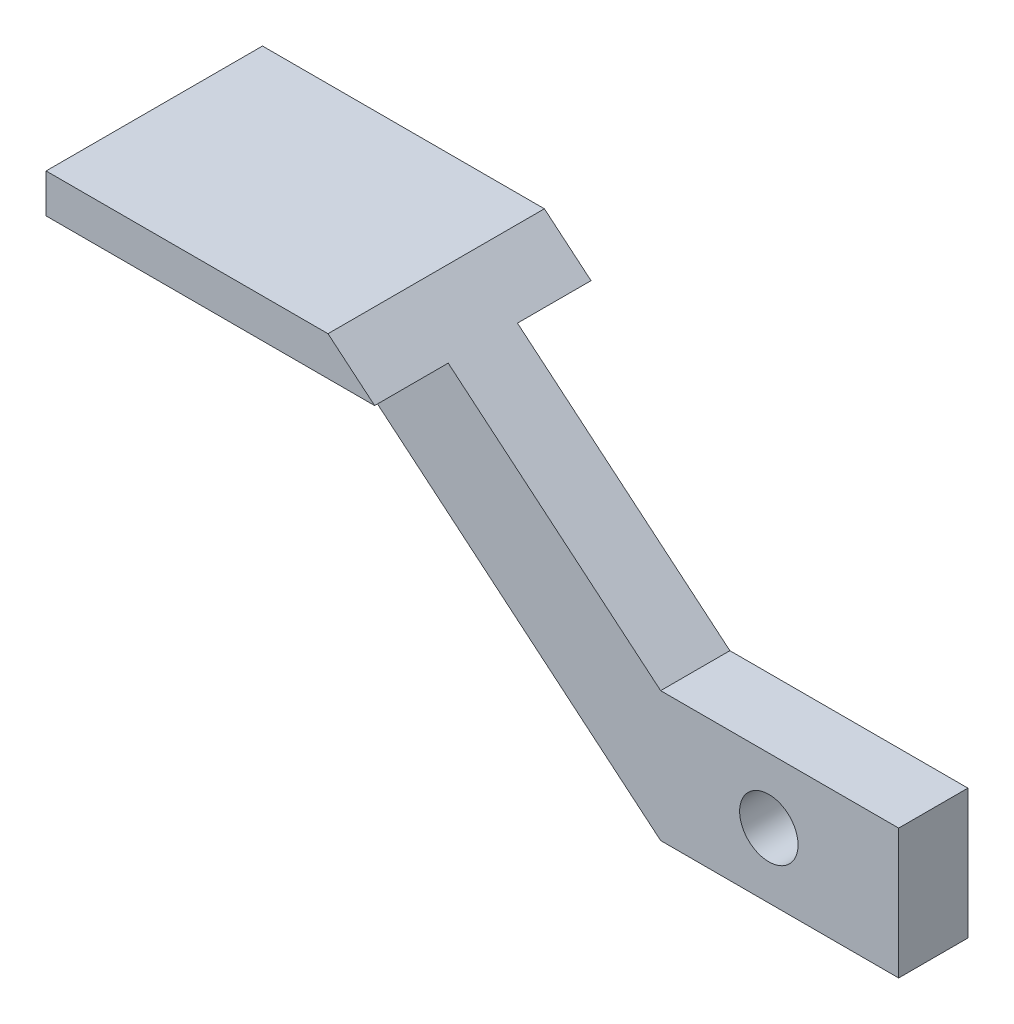
ISO-10303-21;
HEADER;
FILE_DESCRIPTION(('STEP AP214'),'2;1');
FILE_NAME('part.step','',(''),(''),'','','');
FILE_SCHEMA(('AUTOMOTIVE_DESIGN { 1 0 10303 214 1 1 1 1 }'));
ENDSEC;
DATA;
#1=APPLICATION_CONTEXT('core data for automotive mechanical design processes');
#2=APPLICATION_PROTOCOL_DEFINITION('international standard','automotive_design',2000,#1);
#3=PRODUCT_CONTEXT('',#1,'mechanical');
#4=PRODUCT('Part','Part','',(#3));
#5=PRODUCT_RELATED_PRODUCT_CATEGORY('part','',(#4));
#6=PRODUCT_DEFINITION_FORMATION('','',#4);
#7=PRODUCT_DEFINITION_CONTEXT('part definition',#1,'design');
#8=PRODUCT_DEFINITION('design','',#6,#7);
#9=PRODUCT_DEFINITION_SHAPE('','',#8);
#10=(LENGTH_UNIT() NAMED_UNIT(*) SI_UNIT(.MILLI.,.METRE.));
#11=(NAMED_UNIT(*) PLANE_ANGLE_UNIT() SI_UNIT($,.RADIAN.));
#12=(NAMED_UNIT(*) SI_UNIT($,.STERADIAN.) SOLID_ANGLE_UNIT());
#13=UNCERTAINTY_MEASURE_WITH_UNIT(LENGTH_MEASURE(1.E-05),#10,'distance_accuracy_value','');
#14=(GEOMETRIC_REPRESENTATION_CONTEXT(3) GLOBAL_UNCERTAINTY_ASSIGNED_CONTEXT((#13)) GLOBAL_UNIT_ASSIGNED_CONTEXT((#10,
#11,#12)) REPRESENTATION_CONTEXT('',''));
#15=CARTESIAN_POINT('',(0.,0.,0.));
#16=DIRECTION('',(0.,0.,1.));
#17=DIRECTION('',(1.,0.,0.));
#18=AXIS2_PLACEMENT_3D('',#15,#16,#17);
#19=CARTESIAN_POINT('',(0.,0.,8.));
#20=DIRECTION('',(0.,0.,1.));
#21=DIRECTION('',(1.,0.,0.));
#22=AXIS2_PLACEMENT_3D('',#19,#20,#21);
#23=PLANE('',#22);
#24=CARTESIAN_POINT('',(-30.,-15.,8.));
#25=DIRECTION('',(0.,0.,1.));
#26=DIRECTION('',(1.,0.,0.));
#27=AXIS2_PLACEMENT_3D('',#24,#25,#26);
#28=CIRCLE('',#27,6.75);
#29=CARTESIAN_POINT('',(-23.25,-15.,8.));
#30=VERTEX_POINT('',#29);
#31=EDGE_CURVE('E164',#30,#30,#28,.T.);
#32=ORIENTED_EDGE('',*,*,#31,.F.);
#33=EDGE_LOOP('',(#32));
#34=FACE_BOUND('',#33,.T.);
#35=DIRECTION('',(0.767480669158115,-0.641072088355602,0.));
#36=VECTOR('',#35,1.);
#37=CARTESIAN_POINT('',(-22.6035382357737,-27.0605739442361,8.));
#38=LINE('',#37,#36);
#39=CARTESIAN_POINT('',(-104.084507042254,41.,8.));
#40=VERTEX_POINT('',#39);
#41=CARTESIAN_POINT('',(-55.,0.,8.));
#42=VERTEX_POINT('',#41);
#43=EDGE_CURVE('E174',#40,#42,#38,.T.);
#44=ORIENTED_EDGE('',*,*,#43,.F.);
#45=DIRECTION('',(-1.,0.,0.));
#46=VECTOR('',#45,1.);
#47=CARTESIAN_POINT('',(0.,41.,8.));
#48=LINE('',#47,#46);
#49=CARTESIAN_POINT('',(-140.,41.,8.));
#50=VERTEX_POINT('',#49);
#51=EDGE_CURVE('E161',#40,#50,#48,.T.);
#52=ORIENTED_EDGE('',*,*,#51,.T.);
#53=DIRECTION('',(-0.767480669158115,0.641072088355602,0.));
#54=VECTOR('',#53,1.);
#55=CARTESIAN_POINT('',(-37.3638512962661,-44.7313712701777,8.));
#56=LINE('',#55,#54);
#57=CARTESIAN_POINT('',(-55.,-30.,8.));
#58=VERTEX_POINT('',#57);
#59=EDGE_CURVE('E176',#58,#50,#56,.T.);
#60=ORIENTED_EDGE('',*,*,#59,.F.);
#61=DIRECTION('',(1.,0.,0.));
#62=VECTOR('',#61,1.);
#63=CARTESIAN_POINT('',(0.,-30.,8.));
#64=LINE('',#63,#62);
#65=CARTESIAN_POINT('',(0.,-30.,8.));
#66=VERTEX_POINT('',#65);
#67=EDGE_CURVE('E167',#58,#66,#64,.T.);
#68=ORIENTED_EDGE('',*,*,#67,.T.);
#69=DIRECTION('',(0.,1.,0.));
#70=VECTOR('',#69,1.);
#71=CARTESIAN_POINT('',(0.,0.,8.));
#72=LINE('',#71,#70);
#73=CARTESIAN_POINT('',(0.,0.,8.));
#74=VERTEX_POINT('',#73);
#75=EDGE_CURVE('E85',#66,#74,#72,.T.);
#76=ORIENTED_EDGE('',*,*,#75,.T.);
#77=DIRECTION('',(-1.,0.,0.));
#78=VECTOR('',#77,1.);
#79=CARTESIAN_POINT('',(0.,0.,8.));
#80=LINE('',#79,#78);
#81=EDGE_CURVE('E171',#74,#42,#80,.T.);
#82=ORIENTED_EDGE('',*,*,#81,.T.);
#83=EDGE_LOOP('',(#44,#52,#60,#68,#76,#82));
#84=FACE_BOUND('',#83,.T.);
#85=ADVANCED_FACE('F34',(#34,#84),#23,.T.);
#86=CARTESIAN_POINT('',(0.,0.,-8.));
#87=DIRECTION('',(0.,0.,1.));
#88=DIRECTION('',(1.,0.,0.));
#89=AXIS2_PLACEMENT_3D('',#86,#87,#88);
#90=PLANE('',#89);
#91=CARTESIAN_POINT('',(-30.,-15.,-8.));
#92=DIRECTION('',(0.,0.,1.));
#93=DIRECTION('',(1.,0.,0.));
#94=AXIS2_PLACEMENT_3D('',#91,#92,#93);
#95=CIRCLE('',#94,6.75);
#96=CARTESIAN_POINT('',(-23.25,-15.,-8.));
#97=VERTEX_POINT('',#96);
#98=EDGE_CURVE('E163',#97,#97,#95,.T.);
#99=ORIENTED_EDGE('',*,*,#98,.T.);
#100=EDGE_LOOP('',(#99));
#101=FACE_BOUND('',#100,.T.);
#102=DIRECTION('',(-1.,0.,0.));
#103=VECTOR('',#102,1.);
#104=CARTESIAN_POINT('',(0.,41.,-8.));
#105=LINE('',#104,#103);
#106=CARTESIAN_POINT('',(-104.084507042254,41.,-8.));
#107=VERTEX_POINT('',#106);
#108=CARTESIAN_POINT('',(-140.,41.,-8.));
#109=VERTEX_POINT('',#108);
#110=EDGE_CURVE('E11',#107,#109,#105,.T.);
#111=ORIENTED_EDGE('',*,*,#110,.F.);
#112=DIRECTION('',(0.767480669158115,-0.641072088355602,0.));
#113=VECTOR('',#112,1.);
#114=CARTESIAN_POINT('',(-22.6035382357737,-27.0605739442361,-8.));
#115=LINE('',#114,#113);
#116=CARTESIAN_POINT('',(-55.,0.,-8.));
#117=VERTEX_POINT('',#116);
#118=EDGE_CURVE('E187',#107,#117,#115,.T.);
#119=ORIENTED_EDGE('',*,*,#118,.T.);
#120=DIRECTION('',(-1.,0.,0.));
#121=VECTOR('',#120,1.);
#122=CARTESIAN_POINT('',(0.,0.,-8.));
#123=LINE('',#122,#121);
#124=CARTESIAN_POINT('',(0.,0.,-8.));
#125=VERTEX_POINT('',#124);
#126=EDGE_CURVE('E184',#125,#117,#123,.T.);
#127=ORIENTED_EDGE('',*,*,#126,.F.);
#128=DIRECTION('',(0.,1.,0.));
#129=VECTOR('',#128,1.);
#130=CARTESIAN_POINT('',(0.,0.,-8.));
#131=LINE('',#130,#129);
#132=CARTESIAN_POINT('',(0.,-30.,-8.));
#133=VERTEX_POINT('',#132);
#134=EDGE_CURVE('E182',#133,#125,#131,.T.);
#135=ORIENTED_EDGE('',*,*,#134,.F.);
#136=DIRECTION('',(1.,0.,0.));
#137=VECTOR('',#136,1.);
#138=CARTESIAN_POINT('',(0.,-30.,-8.));
#139=LINE('',#138,#137);
#140=CARTESIAN_POINT('',(-55.,-30.,-8.));
#141=VERTEX_POINT('',#140);
#142=EDGE_CURVE('E180',#141,#133,#139,.T.);
#143=ORIENTED_EDGE('',*,*,#142,.F.);
#144=DIRECTION('',(-0.767480669158115,0.641072088355602,0.));
#145=VECTOR('',#144,1.);
#146=CARTESIAN_POINT('',(-37.3638512962661,-44.7313712701777,-8.));
#147=LINE('',#146,#145);
#148=EDGE_CURVE('E168',#141,#109,#147,.T.);
#149=ORIENTED_EDGE('',*,*,#148,.T.);
#150=EDGE_LOOP('',(#111,#119,#127,#135,#143,#149));
#151=FACE_BOUND('',#150,.T.);
#152=ADVANCED_FACE('F203',(#101,#151),#90,.F.);
#153=CARTESIAN_POINT('',(0.,-30.,8.));
#154=DIRECTION('',(0.,1.,0.));
#155=DIRECTION('',(0.,0.,1.));
#156=AXIS2_PLACEMENT_3D('',#153,#154,#155);
#157=PLANE('',#156);
#158=ORIENTED_EDGE('',*,*,#142,.T.);
#159=DIRECTION('',(0.,0.,-1.));
#160=VECTOR('',#159,1.);
#161=CARTESIAN_POINT('',(0.,-30.,8.));
#162=LINE('',#161,#160);
#163=EDGE_CURVE('E42',#66,#133,#162,.T.);
#164=ORIENTED_EDGE('',*,*,#163,.F.);
#165=ORIENTED_EDGE('',*,*,#67,.F.);
#166=DIRECTION('',(0.,0.,-1.));
#167=VECTOR('',#166,1.);
#168=CARTESIAN_POINT('',(-55.,-30.,8.));
#169=LINE('',#168,#167);
#170=EDGE_CURVE('E56',#58,#141,#169,.T.);
#171=ORIENTED_EDGE('',*,*,#170,.T.);
#172=EDGE_LOOP('',(#158,#164,#165,#171));
#173=FACE_BOUND('',#172,.T.);
#174=ADVANCED_FACE('F202',(#173),#157,.F.);
#175=CARTESIAN_POINT('',(0.,0.,8.));
#176=DIRECTION('',(-1.,0.,0.));
#177=DIRECTION('',(0.,0.,1.));
#178=AXIS2_PLACEMENT_3D('',#175,#176,#177);
#179=PLANE('',#178);
#180=ORIENTED_EDGE('',*,*,#134,.T.);
#181=DIRECTION('',(0.,0.,-1.));
#182=VECTOR('',#181,1.);
#183=CARTESIAN_POINT('',(0.,0.,8.));
#184=LINE('',#183,#182);
#185=EDGE_CURVE('E198',#74,#125,#184,.T.);
#186=ORIENTED_EDGE('',*,*,#185,.F.);
#187=ORIENTED_EDGE('',*,*,#75,.F.);
#188=ORIENTED_EDGE('',*,*,#163,.T.);
#189=EDGE_LOOP('',(#180,#186,#187,#188));
#190=FACE_BOUND('',#189,.T.);
#191=ADVANCED_FACE('F201',(#190),#179,.F.);
#192=CARTESIAN_POINT('',(0.,0.,8.));
#193=DIRECTION('',(0.,-1.,0.));
#194=DIRECTION('',(1.,0.,0.));
#195=AXIS2_PLACEMENT_3D('',#192,#193,#194);
#196=PLANE('',#195);
#197=ORIENTED_EDGE('',*,*,#126,.T.);
#198=DIRECTION('',(0.,0.,-1.));
#199=VECTOR('',#198,1.);
#200=CARTESIAN_POINT('',(-55.,0.,8.));
#201=LINE('',#200,#199);
#202=EDGE_CURVE('E195',#42,#117,#201,.T.);
#203=ORIENTED_EDGE('',*,*,#202,.F.);
#204=ORIENTED_EDGE('',*,*,#81,.F.);
#205=ORIENTED_EDGE('',*,*,#185,.T.);
#206=EDGE_LOOP('',(#197,#203,#204,#205));
#207=FACE_BOUND('',#206,.T.);
#208=ADVANCED_FACE('F215',(#207),#196,.F.);
#209=CARTESIAN_POINT('',(-22.6035382357737,-27.0605739442361,8.));
#210=DIRECTION('',(0.641072088355602,0.767480669158115,0.));
#211=DIRECTION('',(-0.767480669158115,0.641072088355602,0.));
#212=AXIS2_PLACEMENT_3D('',#209,#210,#211);
#213=PLANE('',#212);
#214=DIRECTION('',(0.,0.,-1.));
#215=VECTOR('',#214,1.);
#216=CARTESIAN_POINT('',(-104.084507042254,41.,25.));
#217=LINE('',#216,#215);
#218=CARTESIAN_POINT('',(-104.084507042254,41.,25.));
#219=VERTEX_POINT('',#218);
#220=EDGE_CURVE('E136',#219,#40,#217,.T.);
#221=ORIENTED_EDGE('',*,*,#220,.T.);
#222=ORIENTED_EDGE('',*,*,#43,.T.);
#223=ORIENTED_EDGE('',*,*,#202,.T.);
#224=ORIENTED_EDGE('',*,*,#118,.F.);
#225=CARTESIAN_POINT('',(-104.084507042254,41.,-25.));
#226=VERTEX_POINT('',#225);
#227=EDGE_CURVE('E154',#107,#226,#217,.T.);
#228=ORIENTED_EDGE('',*,*,#227,.T.);
#229=DIRECTION('',(-0.767480669158115,0.641072088355602,0.));
#230=VECTOR('',#229,1.);
#231=CARTESIAN_POINT('',(-22.6035382357737,-27.0605739442361,-25.));
#232=LINE('',#231,#230);
#233=CARTESIAN_POINT('',(-114.859154929577,50.,-25.));
#234=VERTEX_POINT('',#233);
#235=EDGE_CURVE('E149',#226,#234,#232,.T.);
#236=ORIENTED_EDGE('',*,*,#235,.T.);
#237=DIRECTION('',(0.,0.,-1.));
#238=VECTOR('',#237,1.);
#239=CARTESIAN_POINT('',(-114.859154929577,50.,8.));
#240=LINE('',#239,#238);
#241=CARTESIAN_POINT('',(-114.859154929577,50.,25.));
#242=VERTEX_POINT('',#241);
#243=EDGE_CURVE('E193',#242,#234,#240,.T.);
#244=ORIENTED_EDGE('',*,*,#243,.F.);
#245=DIRECTION('',(-0.767480669158115,0.641072088355602,0.));
#246=VECTOR('',#245,1.);
#247=CARTESIAN_POINT('',(-22.6035382357737,-27.0605739442361,25.));
#248=LINE('',#247,#246);
#249=EDGE_CURVE('E140',#219,#242,#248,.T.);
#250=ORIENTED_EDGE('',*,*,#249,.F.);
#251=EDGE_LOOP('',(#221,#222,#223,#224,#228,#236,#244,#250));
#252=FACE_BOUND('',#251,.T.);
#253=ADVANCED_FACE('F211',(#252),#213,.T.);
#254=CARTESIAN_POINT('',(0.,50.,8.));
#255=DIRECTION('',(0.,1.,0.));
#256=DIRECTION('',(0.,0.,1.));
#257=AXIS2_PLACEMENT_3D('',#254,#255,#256);
#258=PLANE('',#257);
#259=ORIENTED_EDGE('',*,*,#243,.T.);
#260=DIRECTION('',(-1.,0.,0.));
#261=VECTOR('',#260,1.);
#262=CARTESIAN_POINT('',(0.,50.,-25.));
#263=LINE('',#262,#261);
#264=CARTESIAN_POINT('',(-180.,50.,-25.));
#265=VERTEX_POINT('',#264);
#266=EDGE_CURVE('E146',#234,#265,#263,.T.);
#267=ORIENTED_EDGE('',*,*,#266,.T.);
#268=DIRECTION('',(0.,0.,-1.));
#269=VECTOR('',#268,1.);
#270=CARTESIAN_POINT('',(-180.,50.,8.));
#271=LINE('',#270,#269);
#272=CARTESIAN_POINT('',(-180.,50.,25.));
#273=VERTEX_POINT('',#272);
#274=EDGE_CURVE('E129',#273,#265,#271,.T.);
#275=ORIENTED_EDGE('',*,*,#274,.F.);
#276=DIRECTION('',(-1.,0.,0.));
#277=VECTOR('',#276,1.);
#278=CARTESIAN_POINT('',(0.,50.,25.));
#279=LINE('',#278,#277);
#280=EDGE_CURVE('E145',#242,#273,#279,.T.);
#281=ORIENTED_EDGE('',*,*,#280,.F.);
#282=EDGE_LOOP('',(#259,#267,#275,#281));
#283=FACE_BOUND('',#282,.T.);
#284=ADVANCED_FACE('F220',(#283),#258,.T.);
#285=CARTESIAN_POINT('',(-180.,0.,8.));
#286=DIRECTION('',(-1.,0.,0.));
#287=DIRECTION('',(0.,0.,1.));
#288=AXIS2_PLACEMENT_3D('',#285,#286,#287);
#289=PLANE('',#288);
#290=ORIENTED_EDGE('',*,*,#274,.T.);
#291=DIRECTION('',(0.,-1.,0.));
#292=VECTOR('',#291,1.);
#293=CARTESIAN_POINT('',(-180.,0.,-25.));
#294=LINE('',#293,#292);
#295=CARTESIAN_POINT('',(-180.,41.,-25.));
#296=VERTEX_POINT('',#295);
#297=EDGE_CURVE('E125',#265,#296,#294,.T.);
#298=ORIENTED_EDGE('',*,*,#297,.T.);
#299=DIRECTION('',(0.,0.,-1.));
#300=VECTOR('',#299,1.);
#301=CARTESIAN_POINT('',(-180.,41.,8.));
#302=LINE('',#301,#300);
#303=CARTESIAN_POINT('',(-180.,41.,25.));
#304=VERTEX_POINT('',#303);
#305=EDGE_CURVE('E119',#304,#296,#302,.T.);
#306=ORIENTED_EDGE('',*,*,#305,.F.);
#307=DIRECTION('',(0.,-1.,0.));
#308=VECTOR('',#307,1.);
#309=CARTESIAN_POINT('',(-180.,0.,25.));
#310=LINE('',#309,#308);
#311=EDGE_CURVE('E123',#273,#304,#310,.T.);
#312=ORIENTED_EDGE('',*,*,#311,.F.);
#313=EDGE_LOOP('',(#290,#298,#306,#312));
#314=FACE_BOUND('',#313,.T.);
#315=ADVANCED_FACE('F121',(#314),#289,.T.);
#316=CARTESIAN_POINT('',(0.,41.,8.));
#317=DIRECTION('',(0.,-1.,0.));
#318=DIRECTION('',(0.,0.,-1.));
#319=AXIS2_PLACEMENT_3D('',#316,#317,#318);
#320=PLANE('',#319);
#321=ORIENTED_EDGE('',*,*,#305,.T.);
#322=DIRECTION('',(1.,0.,0.));
#323=VECTOR('',#322,1.);
#324=CARTESIAN_POINT('',(0.,41.,-25.));
#325=LINE('',#324,#323);
#326=EDGE_CURVE('E156',#296,#226,#325,.T.);
#327=ORIENTED_EDGE('',*,*,#326,.T.);
#328=ORIENTED_EDGE('',*,*,#227,.F.);
#329=ORIENTED_EDGE('',*,*,#110,.T.);
#330=DIRECTION('',(0.,0.,-1.));
#331=VECTOR('',#330,1.);
#332=CARTESIAN_POINT('',(-140.,41.,8.));
#333=LINE('',#332,#331);
#334=EDGE_CURVE('E130',#50,#109,#333,.T.);
#335=ORIENTED_EDGE('',*,*,#334,.F.);
#336=ORIENTED_EDGE('',*,*,#51,.F.);
#337=ORIENTED_EDGE('',*,*,#220,.F.);
#338=DIRECTION('',(1.,0.,0.));
#339=VECTOR('',#338,1.);
#340=CARTESIAN_POINT('',(0.,41.,25.));
#341=LINE('',#340,#339);
#342=EDGE_CURVE('E133',#304,#219,#341,.T.);
#343=ORIENTED_EDGE('',*,*,#342,.F.);
#344=EDGE_LOOP('',(#321,#327,#328,#329,#335,#336,#337,#343));
#345=FACE_BOUND('',#344,.T.);
#346=ADVANCED_FACE('F134',(#345),#320,.T.);
#347=CARTESIAN_POINT('',(-30.,-15.,8.));
#348=DIRECTION('',(0.,0.,-1.));
#349=DIRECTION('',(-1.,0.,0.));
#350=AXIS2_PLACEMENT_3D('',#347,#348,#349);
#351=CYLINDRICAL_SURFACE('',#350,6.75);
#352=ORIENTED_EDGE('',*,*,#31,.T.);
#353=EDGE_LOOP('',(#352));
#354=FACE_BOUND('',#353,.T.);
#355=ORIENTED_EDGE('',*,*,#98,.F.);
#356=EDGE_LOOP('',(#355));
#357=FACE_BOUND('',#356,.T.);
#358=ADVANCED_FACE('F36',(#354,#357),#351,.F.);
#359=CARTESIAN_POINT('',(-37.3638512962661,-44.7313712701777,8.));
#360=DIRECTION('',(-0.641072088355602,-0.767480669158115,0.));
#361=DIRECTION('',(0.767480669158115,-0.641072088355602,0.));
#362=AXIS2_PLACEMENT_3D('',#359,#360,#361);
#363=PLANE('',#362);
#364=ORIENTED_EDGE('',*,*,#148,.F.);
#365=ORIENTED_EDGE('',*,*,#170,.F.);
#366=ORIENTED_EDGE('',*,*,#59,.T.);
#367=ORIENTED_EDGE('',*,*,#334,.T.);
#368=EDGE_LOOP('',(#364,#365,#366,#367));
#369=FACE_BOUND('',#368,.T.);
#370=ADVANCED_FACE('F205',(#369),#363,.T.);
#371=CARTESIAN_POINT('',(0.,0.,-25.));
#372=DIRECTION('',(0.,0.,1.));
#373=DIRECTION('',(1.,0.,0.));
#374=AXIS2_PLACEMENT_3D('',#371,#372,#373);
#375=PLANE('',#374);
#376=ORIENTED_EDGE('',*,*,#297,.F.);
#377=ORIENTED_EDGE('',*,*,#266,.F.);
#378=ORIENTED_EDGE('',*,*,#235,.F.);
#379=ORIENTED_EDGE('',*,*,#326,.F.);
#380=EDGE_LOOP('',(#376,#377,#378,#379));
#381=FACE_BOUND('',#380,.T.);
#382=ADVANCED_FACE('F222',(#381),#375,.F.);
#383=CARTESIAN_POINT('',(0.,0.,25.));
#384=DIRECTION('',(0.,0.,1.));
#385=DIRECTION('',(1.,0.,0.));
#386=AXIS2_PLACEMENT_3D('',#383,#384,#385);
#387=PLANE('',#386);
#388=ORIENTED_EDGE('',*,*,#311,.T.);
#389=ORIENTED_EDGE('',*,*,#342,.T.);
#390=ORIENTED_EDGE('',*,*,#249,.T.);
#391=ORIENTED_EDGE('',*,*,#280,.T.);
#392=EDGE_LOOP('',(#388,#389,#390,#391));
#393=FACE_BOUND('',#392,.T.);
#394=ADVANCED_FACE('F143',(#393),#387,.T.);
#395=CLOSED_SHELL('',(#85,#152,#174,#191,#208,#253,#284,#315,#346,#358,#370,#382,#394));
#396=MANIFOLD_SOLID_BREP('B2',#395);
#397=ADVANCED_BREP_SHAPE_REPRESENTATION('',(#18,#396),#14);
#398=SHAPE_DEFINITION_REPRESENTATION(#9,#397);
ENDSEC;
END-ISO-10303-21;
